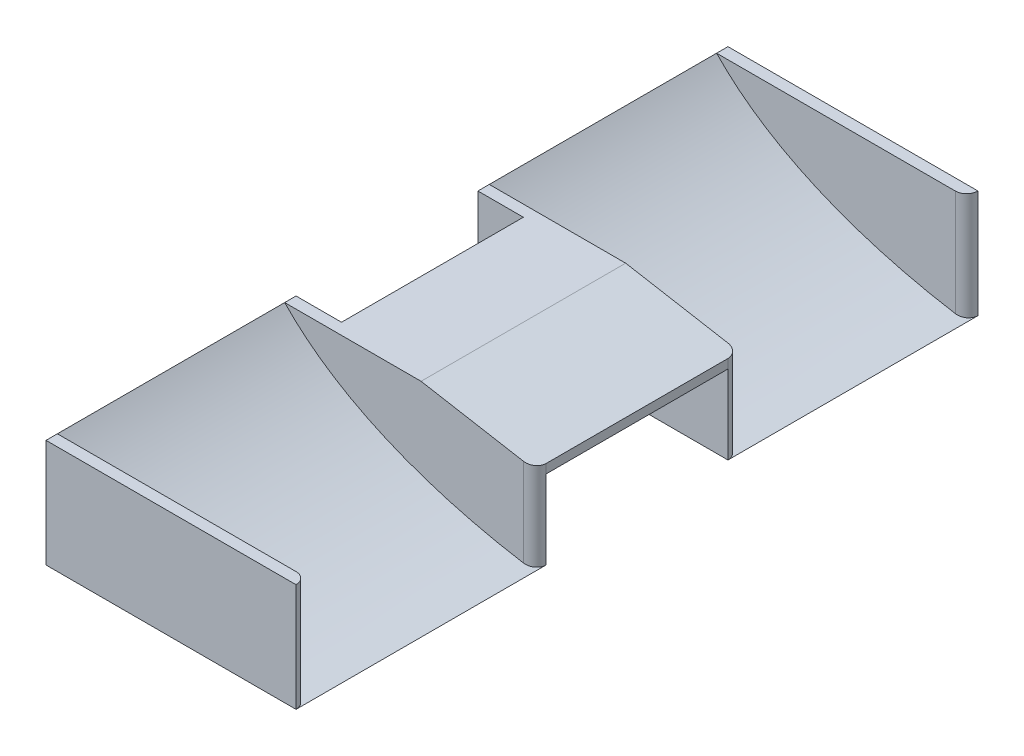
ISO-10303-21;
HEADER;
FILE_DESCRIPTION(('STEP AP214'),'2;1');
FILE_NAME('part.step','',(''),(''),'','','');
FILE_SCHEMA(('AUTOMOTIVE_DESIGN { 1 0 10303 214 1 1 1 1 }'));
ENDSEC;
DATA;
#1=APPLICATION_CONTEXT('core data for automotive mechanical design processes');
#2=APPLICATION_PROTOCOL_DEFINITION('international standard','automotive_design',2000,#1);
#3=PRODUCT_CONTEXT('',#1,'mechanical');
#4=PRODUCT('Part','Part','',(#3));
#5=PRODUCT_RELATED_PRODUCT_CATEGORY('part','',(#4));
#6=PRODUCT_DEFINITION_FORMATION('','',#4);
#7=PRODUCT_DEFINITION_CONTEXT('part definition',#1,'design');
#8=PRODUCT_DEFINITION('design','',#6,#7);
#9=PRODUCT_DEFINITION_SHAPE('','',#8);
#10=(LENGTH_UNIT() NAMED_UNIT(*) SI_UNIT(.MILLI.,.METRE.));
#11=(NAMED_UNIT(*) PLANE_ANGLE_UNIT() SI_UNIT($,.RADIAN.));
#12=(NAMED_UNIT(*) SI_UNIT($,.STERADIAN.) SOLID_ANGLE_UNIT());
#13=UNCERTAINTY_MEASURE_WITH_UNIT(LENGTH_MEASURE(1.E-05),#10,'distance_accuracy_value','');
#14=(GEOMETRIC_REPRESENTATION_CONTEXT(3) GLOBAL_UNCERTAINTY_ASSIGNED_CONTEXT((#13)) GLOBAL_UNIT_ASSIGNED_CONTEXT((#10,
#11,#12)) REPRESENTATION_CONTEXT('',''));
#15=CARTESIAN_POINT('',(0.,0.,0.));
#16=DIRECTION('',(0.,0.,1.));
#17=DIRECTION('',(1.,0.,0.));
#18=AXIS2_PLACEMENT_3D('',#15,#16,#17);
#19=CARTESIAN_POINT('',(-13.0265605576769,-8.,-9.));
#20=DIRECTION('',(0.,1.,0.));
#21=DIRECTION('',(0.,0.,1.));
#22=AXIS2_PLACEMENT_3D('',#19,#20,#21);
#23=PLANE('',#22);
#24=DIRECTION('',(0.,0.,1.));
#25=VECTOR('',#24,1.);
#26=CARTESIAN_POINT('',(8.97343944232308,-8.,-29.));
#27=LINE('',#26,#25);
#28=CARTESIAN_POINT('',(8.97343944232308,-8.,-30.));
#29=VERTEX_POINT('',#28);
#30=CARTESIAN_POINT('',(8.97343944232308,-8.,-8.));
#31=VERTEX_POINT('',#30);
#32=EDGE_CURVE('E66',#29,#31,#27,.T.);
#33=ORIENTED_EDGE('',*,*,#32,.T.);
#34=DIRECTION('',(-1.,0.,0.));
#35=VECTOR('',#34,1.);
#36=CARTESIAN_POINT('',(-13.0265605576769,-8.,-8.));
#37=LINE('',#36,#35);
#38=CARTESIAN_POINT('',(-13.0265605576769,-8.,-8.));
#39=VERTEX_POINT('',#38);
#40=EDGE_CURVE('E449',#31,#39,#37,.T.);
#41=ORIENTED_EDGE('',*,*,#40,.T.);
#42=DIRECTION('',(0.,0.,1.));
#43=VECTOR('',#42,1.);
#44=CARTESIAN_POINT('',(-13.0265605576769,-8.,-9.));
#45=LINE('',#44,#43);
#46=CARTESIAN_POINT('',(-13.0265605576769,-8.,-9.));
#47=VERTEX_POINT('',#46);
#48=EDGE_CURVE('E446',#47,#39,#45,.T.);
#49=ORIENTED_EDGE('',*,*,#48,.F.);
#50=DIRECTION('',(-1.,0.,0.));
#51=VECTOR('',#50,1.);
#52=CARTESIAN_POINT('',(-9.02656055767692,-8.,-9.));
#53=LINE('',#52,#51);
#54=CARTESIAN_POINT('',(4.10596931586014,-8.,-9.));
#55=VERTEX_POINT('',#54);
#56=EDGE_CURVE('E625',#55,#47,#53,.T.);
#57=ORIENTED_EDGE('',*,*,#56,.F.);
#58=DIRECTION('',(0.,0.,1.));
#59=VECTOR('',#58,1.);
#60=CARTESIAN_POINT('',(4.10596931586014,-8.,-29.));
#61=LINE('',#60,#59);
#62=CARTESIAN_POINT('',(4.10596931586014,-8.,-29.));
#63=VERTEX_POINT('',#62);
#64=EDGE_CURVE('E664',#63,#55,#61,.T.);
#65=ORIENTED_EDGE('',*,*,#64,.F.);
#66=DIRECTION('',(-1.,0.,0.));
#67=VECTOR('',#66,1.);
#68=CARTESIAN_POINT('',(-13.0265605576769,-8.,-29.));
#69=LINE('',#68,#67);
#70=CARTESIAN_POINT('',(-13.0265605576769,-8.,-29.));
#71=VERTEX_POINT('',#70);
#72=EDGE_CURVE('E250',#63,#71,#69,.T.);
#73=ORIENTED_EDGE('',*,*,#72,.T.);
#74=DIRECTION('',(0.,0.,1.));
#75=VECTOR('',#74,1.);
#76=CARTESIAN_POINT('',(-13.0265605576769,-8.,-30.));
#77=LINE('',#76,#75);
#78=CARTESIAN_POINT('',(-13.0265605576769,-8.,-30.));
#79=VERTEX_POINT('',#78);
#80=EDGE_CURVE('E257',#79,#71,#77,.T.);
#81=ORIENTED_EDGE('',*,*,#80,.F.);
#82=DIRECTION('',(-1.,0.,0.));
#83=VECTOR('',#82,1.);
#84=CARTESIAN_POINT('',(-13.0265605576769,-8.,-30.));
#85=LINE('',#84,#83);
#86=EDGE_CURVE('E240',#29,#79,#85,.T.);
#87=ORIENTED_EDGE('',*,*,#86,.F.);
#88=EDGE_LOOP('',(#33,#41,#49,#57,#65,#73,#81,#87));
#89=FACE_BOUND('',#88,.T.);
#90=ADVANCED_FACE('F43',(#89),#23,.F.);
#91=CARTESIAN_POINT('',(-13.0265605576769,1.5,-9.));
#92=DIRECTION('',(1.,0.,0.));
#93=DIRECTION('',(0.,0.,-1.));
#94=AXIS2_PLACEMENT_3D('',#91,#92,#93);
#95=PLANE('',#94);
#96=DIRECTION('',(0.,1.,0.));
#97=VECTOR('',#96,1.);
#98=CARTESIAN_POINT('',(-13.0265605576769,1.5,-8.));
#99=LINE('',#98,#97);
#100=CARTESIAN_POINT('',(-13.0265605576769,1.5,-8.));
#101=VERTEX_POINT('',#100);
#102=EDGE_CURVE('E438',#39,#101,#99,.T.);
#103=ORIENTED_EDGE('',*,*,#102,.T.);
#104=DIRECTION('',(0.,0.,1.));
#105=VECTOR('',#104,1.);
#106=CARTESIAN_POINT('',(-13.0265605576769,1.5,-9.));
#107=LINE('',#106,#105);
#108=CARTESIAN_POINT('',(-13.0265605576769,1.5,-9.00000000000001));
#109=VERTEX_POINT('',#108);
#110=EDGE_CURVE('E442',#109,#101,#107,.T.);
#111=ORIENTED_EDGE('',*,*,#110,.F.);
#112=DIRECTION('',(0.,0.,1.));
#113=VECTOR('',#112,1.);
#114=CARTESIAN_POINT('',(-13.0265605576769,1.5,-29.));
#115=LINE('',#114,#113);
#116=CARTESIAN_POINT('',(-13.0265605576769,1.5,-29.));
#117=VERTEX_POINT('',#116);
#118=EDGE_CURVE('E653',#117,#109,#115,.T.);
#119=ORIENTED_EDGE('',*,*,#118,.F.);
#120=DIRECTION('',(0.,0.,1.));
#121=VECTOR('',#120,1.);
#122=CARTESIAN_POINT('',(-13.0265605576769,1.5,-30.));
#123=LINE('',#122,#121);
#124=CARTESIAN_POINT('',(-13.0265605576769,1.5,-30.));
#125=VERTEX_POINT('',#124);
#126=EDGE_CURVE('E247',#125,#117,#123,.T.);
#127=ORIENTED_EDGE('',*,*,#126,.F.);
#128=DIRECTION('',(0.,1.,0.));
#129=VECTOR('',#128,1.);
#130=CARTESIAN_POINT('',(-13.0265605576769,1.5,-30.));
#131=LINE('',#130,#129);
#132=EDGE_CURVE('E231',#79,#125,#131,.T.);
#133=ORIENTED_EDGE('',*,*,#132,.F.);
#134=ORIENTED_EDGE('',*,*,#80,.T.);
#135=DIRECTION('',(0.,1.,0.));
#136=VECTOR('',#135,1.);
#137=CARTESIAN_POINT('',(-13.0265605576769,1.5,-29.));
#138=LINE('',#137,#136);
#139=CARTESIAN_POINT('',(-13.0265605576769,0.,-29.));
#140=VERTEX_POINT('',#139);
#141=EDGE_CURVE('E234',#71,#140,#138,.T.);
#142=ORIENTED_EDGE('',*,*,#141,.T.);
#143=DIRECTION('',(0.,0.,1.));
#144=VECTOR('',#143,1.);
#145=CARTESIAN_POINT('',(-13.0265605576769,0.,-29.));
#146=LINE('',#145,#144);
#147=CARTESIAN_POINT('',(-13.0265605576769,0.,-9.));
#148=VERTEX_POINT('',#147);
#149=EDGE_CURVE('E660',#140,#148,#146,.T.);
#150=ORIENTED_EDGE('',*,*,#149,.T.);
#151=DIRECTION('',(0.,1.,0.));
#152=VECTOR('',#151,1.);
#153=CARTESIAN_POINT('',(-13.0265605576769,1.5,-9.));
#154=LINE('',#153,#152);
#155=EDGE_CURVE('E469',#47,#148,#154,.T.);
#156=ORIENTED_EDGE('',*,*,#155,.F.);
#157=ORIENTED_EDGE('',*,*,#48,.T.);
#158=EDGE_LOOP('',(#103,#111,#119,#127,#133,#134,#142,#150,#156,#157));
#159=FACE_BOUND('',#158,.T.);
#160=ADVANCED_FACE('F411',(#159),#95,.F.);
#161=CARTESIAN_POINT('',(0.,0.,-9.));
#162=DIRECTION('',(0.,0.,1.));
#163=DIRECTION('',(1.,0.,0.));
#164=AXIS2_PLACEMENT_3D('',#161,#162,#163);
#165=PLANE('',#164);
#166=DIRECTION('',(-0.984807753012209,0.173648177666927,0.));
#167=VECTOR('',#166,1.);
#168=CARTESIAN_POINT('',(8.97343944232308,-0.263269807084651,-9.));
#169=LINE('',#168,#167);
#170=CARTESIAN_POINT('',(-1.02656055767713,1.5,-9.));
#171=VERTEX_POINT('',#170);
#172=CARTESIAN_POINT('',(7.97343944232308,-0.0869428263761891,-9.));
#173=VERTEX_POINT('',#172);
#174=EDGE_CURVE('E514',#171,#173,#169,.F.);
#175=ORIENTED_EDGE('',*,*,#174,.T.);
#176=DIRECTION('',(0.,-1.,0.));
#177=VECTOR('',#176,1.);
#178=CARTESIAN_POINT('',(7.97343944232308,-8.,-9.));
#179=LINE('',#178,#177);
#180=CARTESIAN_POINT('',(7.9734394421098,-7.84203256221456,-9.00000000000001));
#181=VERTEX_POINT('',#180);
#182=EDGE_CURVE('E545',#173,#181,#179,.T.);
#183=ORIENTED_EDGE('',*,*,#182,.T.);
#184=CARTESIAN_POINT('',(8.97343944232308,-8.,-9.00000000000001));
#185=CARTESIAN_POINT('',(-0.0304347585319654,-6.64818916617377,-9.00000000000001));
#186=CARTESIAN_POINT('',(-8.24117380389186,-3.530589288179,-9.00000000000001));
#187=CARTESIAN_POINT('',(-13.0265605576769,1.50000000000001,-9.00000000000001));
#188=B_SPLINE_CURVE_WITH_KNOTS('',3,(#184,#185,#186,#187),.UNSPECIFIED.,.F.,.F.,(4,4),(0.,1.),.UNSPECIFIED.);
#189=EDGE_CURVE('E581',#181,#109,#188,.T.);
#190=ORIENTED_EDGE('',*,*,#189,.T.);
#191=DIRECTION('',(1.,0.,0.));
#192=VECTOR('',#191,1.);
#193=CARTESIAN_POINT('',(-9.02656055767692,1.5,-9.));
#194=LINE('',#193,#192);
#195=EDGE_CURVE('E461',#109,#171,#194,.T.);
#196=ORIENTED_EDGE('',*,*,#195,.T.);
#197=EDGE_LOOP('',(#175,#183,#190,#196));
#198=FACE_BOUND('',#197,.T.);
#199=ADVANCED_FACE('F418',(#198),#165,.F.);
#200=CARTESIAN_POINT('',(0.,0.,9.));
#201=DIRECTION('',(0.,0.,1.));
#202=DIRECTION('',(1.,0.,0.));
#203=AXIS2_PLACEMENT_3D('',#200,#201,#202);
#204=PLANE('',#203);
#205=CARTESIAN_POINT('',(8.97343944232308,-8.,8.99999999999999));
#206=CARTESIAN_POINT('',(-0.0304347585319654,-6.64818916617377,8.99999999999999));
#207=CARTESIAN_POINT('',(-8.24117380389186,-3.530589288179,8.99999999999999));
#208=CARTESIAN_POINT('',(-13.0265605576769,1.50000000000001,8.99999999999999));
#209=B_SPLINE_CURVE_WITH_KNOTS('',3,(#205,#206,#207,#208),.UNSPECIFIED.,.F.,.F.,(4,4),(0.,1.),.UNSPECIFIED.);
#210=CARTESIAN_POINT('',(7.9734394421098,-7.84203256221456,8.99999999999999));
#211=VERTEX_POINT('',#210);
#212=CARTESIAN_POINT('',(-13.0265605576769,1.5,9.));
#213=VERTEX_POINT('',#212);
#214=EDGE_CURVE('E493',#211,#213,#209,.T.);
#215=ORIENTED_EDGE('',*,*,#214,.F.);
#216=DIRECTION('',(0.,1.,0.));
#217=VECTOR('',#216,1.);
#218=CARTESIAN_POINT('',(7.97343944232308,0.,9.));
#219=LINE('',#218,#217);
#220=CARTESIAN_POINT('',(7.97343944232308,-0.0869428263761893,9.));
#221=VERTEX_POINT('',#220);
#222=EDGE_CURVE('E357',#211,#221,#219,.T.);
#223=ORIENTED_EDGE('',*,*,#222,.T.);
#224=DIRECTION('',(0.984807753012209,-0.173648177666927,0.));
#225=VECTOR('',#224,1.);
#226=CARTESIAN_POINT('',(0.225560519075216,1.27921727105483,9.));
#227=LINE('',#226,#225);
#228=CARTESIAN_POINT('',(-1.02656055767713,1.5,9.));
#229=VERTEX_POINT('',#228);
#230=EDGE_CURVE('E508',#221,#229,#227,.F.);
#231=ORIENTED_EDGE('',*,*,#230,.T.);
#232=DIRECTION('',(-1.,0.,0.));
#233=VECTOR('',#232,1.);
#234=CARTESIAN_POINT('',(-9.02656055767692,1.5,9.));
#235=LINE('',#234,#233);
#236=EDGE_CURVE('E580',#229,#213,#235,.T.);
#237=ORIENTED_EDGE('',*,*,#236,.T.);
#238=EDGE_LOOP('',(#215,#223,#231,#237));
#239=FACE_BOUND('',#238,.T.);
#240=ADVANCED_FACE('F388',(#239),#204,.T.);
#241=CARTESIAN_POINT('',(-9.02656055767692,1.5,-8.));
#242=DIRECTION('',(0.,1.,0.));
#243=DIRECTION('',(0.,0.,1.));
#244=AXIS2_PLACEMENT_3D('',#241,#242,#243);
#245=PLANE('',#244);
#246=ORIENTED_EDGE('',*,*,#236,.F.);
#247=DIRECTION('',(0.,0.,-1.));
#248=VECTOR('',#247,1.);
#249=CARTESIAN_POINT('',(-1.02656055767713,1.5,-8.));
#250=LINE('',#249,#248);
#251=EDGE_CURVE('E511',#229,#171,#250,.T.);
#252=ORIENTED_EDGE('',*,*,#251,.T.);
#253=ORIENTED_EDGE('',*,*,#195,.F.);
#254=ORIENTED_EDGE('',*,*,#110,.T.);
#255=DIRECTION('',(1.,0.,0.));
#256=VECTOR('',#255,1.);
#257=CARTESIAN_POINT('',(8.97343944232308,1.5,-8.));
#258=LINE('',#257,#256);
#259=CARTESIAN_POINT('',(-9.02656055767692,1.5,-8.));
#260=VERTEX_POINT('',#259);
#261=EDGE_CURVE('E448',#101,#260,#258,.T.);
#262=ORIENTED_EDGE('',*,*,#261,.T.);
#263=DIRECTION('',(0.,0.,1.));
#264=VECTOR('',#263,1.);
#265=CARTESIAN_POINT('',(-9.02656055767692,1.5,-8.));
#266=LINE('',#265,#264);
#267=CARTESIAN_POINT('',(-9.02656055767692,1.5,8.));
#268=VERTEX_POINT('',#267);
#269=EDGE_CURVE('E482',#260,#268,#266,.T.);
#270=ORIENTED_EDGE('',*,*,#269,.T.);
#271=DIRECTION('',(-1.,0.,0.));
#272=VECTOR('',#271,1.);
#273=CARTESIAN_POINT('',(-9.02656055767692,1.5,8.));
#274=LINE('',#273,#272);
#275=CARTESIAN_POINT('',(-13.0265605576769,1.5,7.99999999999998));
#276=VERTEX_POINT('',#275);
#277=EDGE_CURVE('E604',#268,#276,#274,.T.);
#278=ORIENTED_EDGE('',*,*,#277,.T.);
#279=DIRECTION('',(0.,0.,-1.));
#280=VECTOR('',#279,1.);
#281=CARTESIAN_POINT('',(-13.0265605576769,1.5,9.));
#282=LINE('',#281,#280);
#283=EDGE_CURVE('E621',#213,#276,#282,.T.);
#284=ORIENTED_EDGE('',*,*,#283,.F.);
#285=EDGE_LOOP('',(#246,#252,#253,#254,#262,#270,#278,#284));
#286=FACE_BOUND('',#285,.T.);
#287=ADVANCED_FACE('F384',(#286),#245,.T.);
#288=CARTESIAN_POINT('',(8.97343944232308,1.5,-8.));
#289=DIRECTION('',(1.,0.,0.));
#290=DIRECTION('',(0.,0.,-1.));
#291=AXIS2_PLACEMENT_3D('',#288,#289,#290);
#292=PLANE('',#291);
#293=DIRECTION('',(0.,0.,-1.));
#294=VECTOR('',#293,1.);
#295=CARTESIAN_POINT('',(8.97343944232308,-1.06255668237038,-8.));
#296=LINE('',#295,#294);
#297=CARTESIAN_POINT('',(8.97343944232308,-1.06255668237038,8.));
#298=VERTEX_POINT('',#297);
#299=CARTESIAN_POINT('',(8.97343944232308,-1.06255668237038,-8.));
#300=VERTEX_POINT('',#299);
#301=EDGE_CURVE('E521',#298,#300,#296,.T.);
#302=ORIENTED_EDGE('',*,*,#301,.T.);
#303=DIRECTION('',(0.,-1.,0.));
#304=VECTOR('',#303,1.);
#305=CARTESIAN_POINT('',(8.97343944232308,-0.263269807084651,-8.));
#306=LINE('',#305,#304);
#307=CARTESIAN_POINT('',(8.97343944232308,-0.263269807084651,-8.));
#308=VERTEX_POINT('',#307);
#309=EDGE_CURVE('E555',#300,#308,#306,.F.);
#310=ORIENTED_EDGE('',*,*,#309,.T.);
#311=DIRECTION('',(0.,0.,1.));
#312=VECTOR('',#311,1.);
#313=CARTESIAN_POINT('',(8.97343944232308,-0.263269807084651,-8.));
#314=LINE('',#313,#312);
#315=CARTESIAN_POINT('',(8.97343944232308,-0.263269807084651,8.));
#316=VERTEX_POINT('',#315);
#317=EDGE_CURVE('E501',#308,#316,#314,.T.);
#318=ORIENTED_EDGE('',*,*,#317,.T.);
#319=DIRECTION('',(0.,1.,0.));
#320=VECTOR('',#319,1.);
#321=CARTESIAN_POINT('',(8.97343944232308,1.5,8.));
#322=LINE('',#321,#320);
#323=EDGE_CURVE('E552',#316,#298,#322,.F.);
#324=ORIENTED_EDGE('',*,*,#323,.T.);
#325=EDGE_LOOP('',(#302,#310,#318,#324));
#326=FACE_BOUND('',#325,.T.);
#327=ADVANCED_FACE('F387',(#326),#292,.T.);
#328=CARTESIAN_POINT('',(-9.02656055767692,-1.5,-8.));
#329=DIRECTION('',(0.,-1.,0.));
#330=DIRECTION('',(0.,0.,-1.));
#331=AXIS2_PLACEMENT_3D('',#328,#329,#330);
#332=PLANE('',#331);
#333=DIRECTION('',(1.,0.,0.));
#334=VECTOR('',#333,1.);
#335=CARTESIAN_POINT('',(-9.02656055767692,-1.5,-8.));
#336=LINE('',#335,#334);
#337=CARTESIAN_POINT('',(-9.02656055767692,-1.5,-8.));
#338=VERTEX_POINT('',#337);
#339=CARTESIAN_POINT('',(3.97343944232286,-1.5,-8.));
#340=VERTEX_POINT('',#339);
#341=EDGE_CURVE('E478',#338,#340,#336,.T.);
#342=ORIENTED_EDGE('',*,*,#341,.T.);
#343=DIRECTION('',(0.,0.,1.));
#344=VECTOR('',#343,1.);
#345=CARTESIAN_POINT('',(3.97343944232286,-1.5,-8.));
#346=LINE('',#345,#344);
#347=CARTESIAN_POINT('',(3.97343944232286,-1.5,8.));
#348=VERTEX_POINT('',#347);
#349=EDGE_CURVE('E518',#340,#348,#346,.T.);
#350=ORIENTED_EDGE('',*,*,#349,.T.);
#351=DIRECTION('',(1.,0.,0.));
#352=VECTOR('',#351,1.);
#353=CARTESIAN_POINT('',(-9.02656055767692,-1.5,8.));
#354=LINE('',#353,#352);
#355=CARTESIAN_POINT('',(-9.02656055767692,-1.5,8.));
#356=VERTEX_POINT('',#355);
#357=EDGE_CURVE('E474',#356,#348,#354,.T.);
#358=ORIENTED_EDGE('',*,*,#357,.F.);
#359=DIRECTION('',(0.,0.,1.));
#360=VECTOR('',#359,1.);
#361=CARTESIAN_POINT('',(-9.02656055767692,-1.5,-8.));
#362=LINE('',#361,#360);
#363=EDGE_CURVE('E483',#338,#356,#362,.T.);
#364=ORIENTED_EDGE('',*,*,#363,.F.);
#365=EDGE_LOOP('',(#342,#350,#358,#364));
#366=FACE_BOUND('',#365,.T.);
#367=ADVANCED_FACE('F394',(#366),#332,.T.);
#368=CARTESIAN_POINT('',(-9.02656055767692,1.5,-8.));
#369=DIRECTION('',(-1.,0.,0.));
#370=DIRECTION('',(0.,0.,1.));
#371=AXIS2_PLACEMENT_3D('',#368,#369,#370);
#372=PLANE('',#371);
#373=ORIENTED_EDGE('',*,*,#363,.T.);
#374=DIRECTION('',(0.,-1.,0.));
#375=VECTOR('',#374,1.);
#376=CARTESIAN_POINT('',(-9.02656055767692,1.5,8.));
#377=LINE('',#376,#375);
#378=EDGE_CURVE('E467',#268,#356,#377,.T.);
#379=ORIENTED_EDGE('',*,*,#378,.F.);
#380=ORIENTED_EDGE('',*,*,#269,.F.);
#381=DIRECTION('',(0.,-1.,0.));
#382=VECTOR('',#381,1.);
#383=CARTESIAN_POINT('',(-9.02656055767692,1.5,-8.));
#384=LINE('',#383,#382);
#385=EDGE_CURVE('E453',#260,#338,#384,.T.);
#386=ORIENTED_EDGE('',*,*,#385,.T.);
#387=EDGE_LOOP('',(#373,#379,#380,#386));
#388=FACE_BOUND('',#387,.T.);
#389=ADVANCED_FACE('F390',(#388),#372,.T.);
#390=CARTESIAN_POINT('',(0.,0.,-8.));
#391=DIRECTION('',(0.,0.,1.));
#392=DIRECTION('',(1.,0.,0.));
#393=AXIS2_PLACEMENT_3D('',#390,#391,#392);
#394=PLANE('',#393);
#395=ORIENTED_EDGE('',*,*,#261,.F.);
#396=ORIENTED_EDGE('',*,*,#102,.F.);
#397=ORIENTED_EDGE('',*,*,#40,.F.);
#398=DIRECTION('',(0.,-1.,0.));
#399=VECTOR('',#398,1.);
#400=CARTESIAN_POINT('',(8.97343944232308,-8.,-8.));
#401=LINE('',#400,#399);
#402=EDGE_CURVE('E456',#300,#31,#401,.T.);
#403=ORIENTED_EDGE('',*,*,#402,.F.);
#404=DIRECTION('',(0.996194698091746,0.0871557427476548,0.));
#405=VECTOR('',#404,1.);
#406=CARTESIAN_POINT('',(3.97343944232286,-1.5,-8.));
#407=LINE('',#406,#405);
#408=EDGE_CURVE('E528',#300,#340,#407,.F.);
#409=ORIENTED_EDGE('',*,*,#408,.T.);
#410=ORIENTED_EDGE('',*,*,#341,.F.);
#411=ORIENTED_EDGE('',*,*,#385,.F.);
#412=EDGE_LOOP('',(#395,#396,#397,#403,#409,#410,#411));
#413=FACE_BOUND('',#412,.T.);
#414=ADVANCED_FACE('F393',(#413),#394,.T.);
#415=DIRECTION('',(1.,0.,0.));
#416=VECTOR('',#415,1.);
#417=CARTESIAN_POINT('',(-9.02656055767692,-8.,8.));
#418=LINE('',#417,#416);
#419=CARTESIAN_POINT('',(-13.0265605576769,-8.,8.));
#420=VERTEX_POINT('',#419);
#421=CARTESIAN_POINT('',(8.97343944232308,-8.,7.99999999999998));
#422=VERTEX_POINT('',#421);
#423=EDGE_CURVE('E589',#420,#422,#418,.T.);
#424=ORIENTED_EDGE('',*,*,#423,.T.);
#425=CARTESIAN_POINT('',(8.97343944232308,-8.,30.));
#426=VERTEX_POINT('',#425);
#427=EDGE_CURVE('E666',#422,#426,#27,.T.);
#428=ORIENTED_EDGE('',*,*,#427,.T.);
#429=DIRECTION('',(1.,0.,0.));
#430=VECTOR('',#429,1.);
#431=CARTESIAN_POINT('',(-13.0265605576769,-8.,30.));
#432=LINE('',#431,#430);
#433=CARTESIAN_POINT('',(-13.0265605576769,-8.,30.));
#434=VERTEX_POINT('',#433);
#435=EDGE_CURVE('E269',#434,#426,#432,.T.);
#436=ORIENTED_EDGE('',*,*,#435,.F.);
#437=DIRECTION('',(0.,0.,-1.));
#438=VECTOR('',#437,1.);
#439=CARTESIAN_POINT('',(-13.0265605576769,-8.,30.));
#440=LINE('',#439,#438);
#441=CARTESIAN_POINT('',(-13.0265605576769,-8.,29.));
#442=VERTEX_POINT('',#441);
#443=EDGE_CURVE('E277',#434,#442,#440,.T.);
#444=ORIENTED_EDGE('',*,*,#443,.T.);
#445=DIRECTION('',(1.,0.,0.));
#446=VECTOR('',#445,1.);
#447=CARTESIAN_POINT('',(-13.0265605576769,-8.,29.));
#448=LINE('',#447,#446);
#449=CARTESIAN_POINT('',(4.10596931586014,-8.,29.));
#450=VERTEX_POINT('',#449);
#451=EDGE_CURVE('E266',#442,#450,#448,.T.);
#452=ORIENTED_EDGE('',*,*,#451,.T.);
#453=CARTESIAN_POINT('',(4.10596931586014,-8.,9.));
#454=VERTEX_POINT('',#453);
#455=EDGE_CURVE('E663',#454,#450,#61,.T.);
#456=ORIENTED_EDGE('',*,*,#455,.F.);
#457=DIRECTION('',(1.,0.,0.));
#458=VECTOR('',#457,1.);
#459=CARTESIAN_POINT('',(-13.0265605576769,-8.,9.));
#460=LINE('',#459,#458);
#461=CARTESIAN_POINT('',(-13.0265605576769,-8.,9.));
#462=VERTEX_POINT('',#461);
#463=EDGE_CURVE('E607',#462,#454,#460,.T.);
#464=ORIENTED_EDGE('',*,*,#463,.F.);
#465=DIRECTION('',(0.,0.,-1.));
#466=VECTOR('',#465,1.);
#467=CARTESIAN_POINT('',(-13.0265605576769,-8.,9.));
#468=LINE('',#467,#466);
#469=EDGE_CURVE('E609',#462,#420,#468,.T.);
#470=ORIENTED_EDGE('',*,*,#469,.T.);
#471=EDGE_LOOP('',(#424,#428,#436,#444,#452,#456,#464,#470));
#472=FACE_BOUND('',#471,.T.);
#473=ADVANCED_FACE('F402',(#472),#23,.F.);
#474=ORIENTED_EDGE('',*,*,#283,.T.);
#475=DIRECTION('',(0.,-1.,0.));
#476=VECTOR('',#475,1.);
#477=CARTESIAN_POINT('',(-13.0265605576769,1.5,8.));
#478=LINE('',#477,#476);
#479=EDGE_CURVE('E583',#276,#420,#478,.T.);
#480=ORIENTED_EDGE('',*,*,#479,.T.);
#481=ORIENTED_EDGE('',*,*,#469,.F.);
#482=DIRECTION('',(0.,-1.,0.));
#483=VECTOR('',#482,1.);
#484=CARTESIAN_POINT('',(-13.0265605576769,1.5,9.));
#485=LINE('',#484,#483);
#486=CARTESIAN_POINT('',(-13.0265605576769,0.,8.99999999999999));
#487=VERTEX_POINT('',#486);
#488=EDGE_CURVE('E603',#487,#462,#485,.T.);
#489=ORIENTED_EDGE('',*,*,#488,.F.);
#490=CARTESIAN_POINT('',(-13.0265605576769,0.,29.));
#491=VERTEX_POINT('',#490);
#492=EDGE_CURVE('E657',#487,#491,#146,.T.);
#493=ORIENTED_EDGE('',*,*,#492,.T.);
#494=DIRECTION('',(0.,-1.,0.));
#495=VECTOR('',#494,1.);
#496=CARTESIAN_POINT('',(-13.0265605576769,1.5,29.));
#497=LINE('',#496,#495);
#498=EDGE_CURVE('E281',#491,#442,#497,.T.);
#499=ORIENTED_EDGE('',*,*,#498,.T.);
#500=ORIENTED_EDGE('',*,*,#443,.F.);
#501=DIRECTION('',(0.,-1.,0.));
#502=VECTOR('',#501,1.);
#503=CARTESIAN_POINT('',(-13.0265605576769,1.5,30.));
#504=LINE('',#503,#502);
#505=CARTESIAN_POINT('',(-13.0265605576769,1.5,30.));
#506=VERTEX_POINT('',#505);
#507=EDGE_CURVE('E265',#506,#434,#504,.T.);
#508=ORIENTED_EDGE('',*,*,#507,.F.);
#509=DIRECTION('',(0.,0.,-1.));
#510=VECTOR('',#509,1.);
#511=CARTESIAN_POINT('',(-13.0265605576769,1.5,30.));
#512=LINE('',#511,#510);
#513=CARTESIAN_POINT('',(-13.0265605576769,1.5,29.));
#514=VERTEX_POINT('',#513);
#515=EDGE_CURVE('E287',#506,#514,#512,.T.);
#516=ORIENTED_EDGE('',*,*,#515,.T.);
#517=EDGE_CURVE('E650',#213,#514,#115,.T.);
#518=ORIENTED_EDGE('',*,*,#517,.F.);
#519=EDGE_LOOP('',(#474,#480,#481,#489,#493,#499,#500,#508,#516,#518));
#520=FACE_BOUND('',#519,.T.);
#521=ADVANCED_FACE('F405',(#520),#95,.F.);
#522=ORIENTED_EDGE('',*,*,#155,.T.);
#523=CARTESIAN_POINT('',(-13.0265605576769,0.,-9.00000000000001));
#524=CARTESIAN_POINT('',(-5.6316636817653,-6.68042013227032,-9.00000000000001));
#525=CARTESIAN_POINT('',(4.10596931586014,-8.,-9.00000000000001));
#526=B_SPLINE_CURVE_WITH_KNOTS('',2,(#523,#524,#525),.UNSPECIFIED.,.F.,.F.,(3,3),(0.,1.),.UNSPECIFIED.);
#527=EDGE_CURVE('E584',#148,#55,#526,.T.);
#528=ORIENTED_EDGE('',*,*,#527,.T.);
#529=ORIENTED_EDGE('',*,*,#56,.T.);
#530=EDGE_LOOP('',(#522,#528,#529));
#531=FACE_BOUND('',#530,.T.);
#532=ADVANCED_FACE('F409',(#531),#165,.F.);
#533=CARTESIAN_POINT('',(0.,0.,8.));
#534=DIRECTION('',(0.,0.,1.));
#535=DIRECTION('',(1.,0.,0.));
#536=AXIS2_PLACEMENT_3D('',#533,#534,#535);
#537=PLANE('',#536);
#538=ORIENTED_EDGE('',*,*,#378,.T.);
#539=ORIENTED_EDGE('',*,*,#357,.T.);
#540=DIRECTION('',(-0.996194698091746,-0.0871557427476548,0.));
#541=VECTOR('',#540,1.);
#542=CARTESIAN_POINT('',(0.160418869949592,-1.83359607387378,8.));
#543=LINE('',#542,#541);
#544=EDGE_CURVE('E525',#348,#298,#543,.F.);
#545=ORIENTED_EDGE('',*,*,#544,.T.);
#546=DIRECTION('',(0.,1.,0.));
#547=VECTOR('',#546,1.);
#548=CARTESIAN_POINT('',(8.97343944232308,1.5,8.));
#549=LINE('',#548,#547);
#550=EDGE_CURVE('E613',#422,#298,#549,.T.);
#551=ORIENTED_EDGE('',*,*,#550,.F.);
#552=ORIENTED_EDGE('',*,*,#423,.F.);
#553=ORIENTED_EDGE('',*,*,#479,.F.);
#554=ORIENTED_EDGE('',*,*,#277,.F.);
#555=EDGE_LOOP('',(#538,#539,#545,#551,#552,#553,#554));
#556=FACE_BOUND('',#555,.T.);
#557=ADVANCED_FACE('F416',(#556),#537,.F.);
#558=CARTESIAN_POINT('',(-13.0265605576769,0.,8.99999999999999));
#559=CARTESIAN_POINT('',(-5.6316636817653,-6.68042013227032,8.99999999999999));
#560=CARTESIAN_POINT('',(4.10596931586014,-8.,8.99999999999999));
#561=B_SPLINE_CURVE_WITH_KNOTS('',2,(#558,#559,#560),.UNSPECIFIED.,.F.,.F.,(3,3),(0.,1.),.UNSPECIFIED.);
#562=EDGE_CURVE('E485',#487,#454,#561,.T.);
#563=ORIENTED_EDGE('',*,*,#562,.F.);
#564=ORIENTED_EDGE('',*,*,#488,.T.);
#565=ORIENTED_EDGE('',*,*,#463,.T.);
#566=EDGE_LOOP('',(#563,#564,#565));
#567=FACE_BOUND('',#566,.T.);
#568=ADVANCED_FACE('F330',(#567),#204,.T.);
#569=CARTESIAN_POINT('',(-13.0265605576769,0.,-29.));
#570=CARTESIAN_POINT('',(-5.6316636817653,-6.68042013227032,-29.));
#571=CARTESIAN_POINT('',(4.10596931586014,-8.,-29.));
#572=B_SPLINE_CURVE_WITH_KNOTS('',2,(#569,#570,#571),.UNSPECIFIED.,.F.,.F.,(3,3),(0.,1.),.UNSPECIFIED.);
#573=DIRECTION('',(0.,0.,1.));
#574=VECTOR('',#573,1.);
#575=SURFACE_OF_LINEAR_EXTRUSION('',#572,#574);
#576=ORIENTED_EDGE('',*,*,#492,.F.);
#577=ORIENTED_EDGE('',*,*,#562,.T.);
#578=ORIENTED_EDGE('',*,*,#455,.T.);
#579=CARTESIAN_POINT('',(-13.0265605576769,0.,29.));
#580=CARTESIAN_POINT('',(-5.6316636817653,-6.68042013227032,29.));
#581=CARTESIAN_POINT('',(4.10596931586014,-8.,29.));
#582=B_SPLINE_CURVE_WITH_KNOTS('',2,(#579,#580,#581),.UNSPECIFIED.,.F.,.F.,(3,3),(0.,1.),.UNSPECIFIED.);
#583=EDGE_CURVE('E296',#491,#450,#582,.T.);
#584=ORIENTED_EDGE('',*,*,#583,.F.);
#585=EDGE_LOOP('',(#576,#577,#578,#584));
#586=FACE_BOUND('',#585,.T.);
#587=ADVANCED_FACE('F327',(#586),#575,.T.);
#588=CARTESIAN_POINT('',(8.97343944232308,-8.,-29.));
#589=CARTESIAN_POINT('',(-0.0304347585319654,-6.64818916617377,-29.));
#590=CARTESIAN_POINT('',(-8.24117380389186,-3.530589288179,-29.));
#591=CARTESIAN_POINT('',(-13.0265605576769,1.50000000000001,-29.));
#592=B_SPLINE_CURVE_WITH_KNOTS('',3,(#588,#589,#590,#591),.UNSPECIFIED.,.F.,.F.,(4,4),(0.,1.),.UNSPECIFIED.);
#593=DIRECTION('',(0.,0.,1.));
#594=VECTOR('',#593,1.);
#595=SURFACE_OF_LINEAR_EXTRUSION('',#592,#594);
#596=ORIENTED_EDGE('',*,*,#427,.F.);
#597=CARTESIAN_POINT('',(8.97343944232308,-8.,7.99999999999999));
#598=CARTESIAN_POINT('',(8.9734394066341,-7.99999989144172,8.02790144058581));
#599=CARTESIAN_POINT('',(8.97227095366752,-7.99982457822493,8.05578943188641));
#600=CARTESIAN_POINT('',(8.96761059908037,-7.99912467659939,8.11136428431285));
#601=CARTESIAN_POINT('',(8.96411885300271,-7.99860011157282,8.13905115877788));
#602=CARTESIAN_POINT('',(8.95019655547529,-7.99650691673296,8.22144764477495));
#603=CARTESIAN_POINT('',(8.93631882387218,-7.99441877540103,8.2756027686183));
#604=CARTESIAN_POINT('',(8.89978176448272,-7.98890177077607,8.38078229995006));
#605=CARTESIAN_POINT('',(8.87711908474783,-7.98547239572297,8.43180550381788));
#606=CARTESIAN_POINT('',(8.82368829483207,-7.977348344156,8.52930574631431));
#607=CARTESIAN_POINT('',(8.79292095431061,-7.97265378778915,8.57578321605429));
#608=CARTESIAN_POINT('',(8.72403469081616,-7.96208121666909,8.66311107069498));
#609=CARTESIAN_POINT('',(8.68588253240135,-7.95619784618109,8.70393452826106));
#610=CARTESIAN_POINT('',(8.60339638842759,-7.94339104027714,8.77861804830526));
#611=CARTESIAN_POINT('',(8.55906191721378,-7.93646752314861,8.81247756320949));
#612=CARTESIAN_POINT('',(8.48867312314061,-7.92539298479418,8.85751102298008));
#613=CARTESIAN_POINT('',(8.46440531781442,-7.92156157203195,8.8716296674879));
#614=CARTESIAN_POINT('',(8.41481996386365,-7.9137033267037,8.8977572873855));
#615=CARTESIAN_POINT('',(8.38950337957029,-7.90967667310144,8.90976814986094));
#616=CARTESIAN_POINT('',(8.31220618317068,-7.89733394877574,8.94252919878217));
#617=CARTESIAN_POINT('',(8.25883918118237,-7.8887489988958,8.96003268934162));
#618=CARTESIAN_POINT('',(8.16659637026708,-7.8737873753367,8.98194226539419));
#619=CARTESIAN_POINT('',(8.12823547425235,-7.86753080516298,8.98871074497053));
#620=CARTESIAN_POINT('',(8.05106787342711,-7.85487352698097,8.99773806399755));
#621=CARTESIAN_POINT('',(8.01226189483263,-7.84847304087628,9.00000342125892));
#622=CARTESIAN_POINT('',(7.97343944211441,-7.84203256221532,8.99999999999998));
#623=B_SPLINE_CURVE_WITH_KNOTS('',3,(#597,#598,#599,#600,#601,#602,#603,#604,#605,#606,#607,
#608,#609,#610,#611,#612,#613,#614,#615,#616,#617,#618,#619,#620,#621,#622),.UNSPECIFIED.,.F.,
.F.,(4,2,2,2,2,2,2,2,2,2,2,2,4),(0.,0.0836526384536281,0.167299676983135,0.3342690115025,
0.501302116960028,0.668319365827675,0.836106529176327,1.0039068805676,1.08882895743149,
1.17367461177862,1.34322782122924,1.46134782709189,1.57929674143257),.UNSPECIFIED.);
#624=EDGE_CURVE('E11',#422,#211,#623,.T.);
#625=ORIENTED_EDGE('',*,*,#624,.T.);
#626=ORIENTED_EDGE('',*,*,#214,.T.);
#627=ORIENTED_EDGE('',*,*,#517,.T.);
#628=CARTESIAN_POINT('',(8.97343944232308,-8.,29.));
#629=CARTESIAN_POINT('',(-0.0304347585319654,-6.64818916617377,29.));
#630=CARTESIAN_POINT('',(-8.24117380389186,-3.530589288179,29.));
#631=CARTESIAN_POINT('',(-13.0265605576769,1.50000000000001,29.));
#632=B_SPLINE_CURVE_WITH_KNOTS('',3,(#628,#629,#630,#631),.UNSPECIFIED.,.F.,.F.,(4,4),(0.,1.),.UNSPECIFIED.);
#633=CARTESIAN_POINT('',(7.9734394421098,-7.84203256221456,29.));
#634=VERTEX_POINT('',#633);
#635=EDGE_CURVE('E291',#634,#514,#632,.T.);
#636=ORIENTED_EDGE('',*,*,#635,.F.);
#637=CARTESIAN_POINT('',(7.97343944232308,-7.84203256092884,29.));
#638=CARTESIAN_POINT('',(8.03016997583015,-7.85144600404237,28.9999597394985));
#639=CARTESIAN_POINT('',(8.08689434495612,-7.86077549547889,29.0048264411131));
#640=CARTESIAN_POINT('',(8.19875249478948,-7.87902689024578,29.0240732855129));
#641=CARTESIAN_POINT('',(8.25388683270848,-7.88794893701695,29.0384500522463));
#642=CARTESIAN_POINT('',(8.36106464925056,-7.90515847665624,29.0764295251471));
#643=CARTESIAN_POINT('',(8.41310605420221,-7.91344554485316,29.1000383423641));
#644=CARTESIAN_POINT('',(8.48759752209311,-7.92522380457073,29.1418307433686));
#645=CARTESIAN_POINT('',(8.51183401327045,-7.92904133975707,29.1568256374246));
#646=CARTESIAN_POINT('',(8.55898913341343,-7.93644337152212,29.1888620291423));
#647=CARTESIAN_POINT('',(8.5819064185925,-7.94002763094738,29.2059055609039));
#648=CARTESIAN_POINT('',(8.64803744972589,-7.95033703612205,29.2596470213031));
#649=CARTESIAN_POINT('',(8.68904812096388,-7.95668470063941,29.2991907747679));
#650=CARTESIAN_POINT('',(8.76382660400349,-7.96819918005409,29.3847634323089));
#651=CARTESIAN_POINT('',(8.79759527680505,-7.97336613533052,29.4307915643792));
#652=CARTESIAN_POINT('',(8.84186856161504,-7.98011372715295,29.5033860785117));
#653=CARTESIAN_POINT('',(8.85550885717307,-7.98218762973641,29.5280402976541));
#654=CARTESIAN_POINT('',(8.88066092851462,-7.98600500144506,29.5784060828163));
#655=CARTESIAN_POINT('',(8.89217456691508,-7.98774875975847,29.6041166992353));
#656=CARTESIAN_POINT('',(8.92339101500357,-7.99246989840067,29.6825868949606));
#657=CARTESIAN_POINT('',(8.93980536107242,-7.99494261135952,29.7367439179469));
#658=CARTESIAN_POINT('',(8.95882042520316,-7.99780389338,29.8260667348577));
#659=CARTESIAN_POINT('',(8.96429916957646,-7.99862723647424,29.860644017013));
#660=CARTESIAN_POINT('',(8.97160680030155,-7.99972486143962,29.9301401653722));
#661=CARTESIAN_POINT('',(8.97344095152305,-7.99999993532575,29.9650584655136));
#662=CARTESIAN_POINT('',(8.97343944232308,-8.,30.));
#663=B_SPLINE_CURVE_WITH_KNOTS('',3,(#637,#638,#639,#640,#641,#642,#643,#644,#645,#646,#647,
#648,#649,#650,#651,#652,#653,#654,#655,#656,#657,#658,#659,#660,#661,#662),.UNSPECIFIED.,.F.,
.F.,(4,2,2,2,2,2,2,2,2,2,2,2,4),(0.,0.172278532059769,0.344495938423672,0.516827535617109,
0.603001844044746,0.689262433230939,0.860351225728607,1.03141966621919,1.11608574555376,
1.20067731541598,1.36965481244987,1.47453611738525,1.57926580347608),.UNSPECIFIED.);
#664=EDGE_CURVE('E343',#634,#426,#663,.T.);
#665=ORIENTED_EDGE('',*,*,#664,.T.);
#666=EDGE_LOOP('',(#596,#625,#626,#627,#636,#665));
#667=FACE_BOUND('',#666,.T.);
#668=ADVANCED_FACE('F321',(#667),#595,.T.);
#669=ORIENTED_EDGE('',*,*,#189,.F.);
#670=CARTESIAN_POINT('',(7.97343944232308,-7.84203256092884,-9.));
#671=CARTESIAN_POINT('',(8.03016997583014,-7.85144600404237,-9.00004026050154));
#672=CARTESIAN_POINT('',(8.08689434495611,-7.86077549547889,-8.99517355888694));
#673=CARTESIAN_POINT('',(8.19875249478948,-7.87902689024578,-8.97592671448708));
#674=CARTESIAN_POINT('',(8.25388683270847,-7.88794893701694,-8.9615499477537));
#675=CARTESIAN_POINT('',(8.36106464925055,-7.90515847665624,-8.92357047485296));
#676=CARTESIAN_POINT('',(8.4131060542022,-7.91344554485316,-8.89996165763589));
#677=CARTESIAN_POINT('',(8.4875975220931,-7.92522380457073,-8.85816925663141));
#678=CARTESIAN_POINT('',(8.51183401327044,-7.92904133975707,-8.84317436257545));
#679=CARTESIAN_POINT('',(8.55898913341342,-7.93644337152212,-8.81113797085768));
#680=CARTESIAN_POINT('',(8.5819064185925,-7.94002763094739,-8.79409443909608));
#681=CARTESIAN_POINT('',(8.64803744972589,-7.95033703612206,-8.74035297869688));
#682=CARTESIAN_POINT('',(8.68904812096388,-7.95668470063942,-8.70080922523216));
#683=CARTESIAN_POINT('',(8.76382660400348,-7.96819918005409,-8.61523656769114));
#684=CARTESIAN_POINT('',(8.79759527680504,-7.97336613533051,-8.5692084356208));
#685=CARTESIAN_POINT('',(8.84186856161504,-7.98011372715294,-8.49661392148827));
#686=CARTESIAN_POINT('',(8.85550885717306,-7.98218762973641,-8.47195970234588));
#687=CARTESIAN_POINT('',(8.88066092851461,-7.98600500144505,-8.42159391718374));
#688=CARTESIAN_POINT('',(8.89217456691508,-7.98774875975847,-8.39588330076467));
#689=CARTESIAN_POINT('',(8.92339101500357,-7.99246989840066,-8.31741310503942));
#690=CARTESIAN_POINT('',(8.9398053610724,-7.99494261135952,-8.2632560820531));
#691=CARTESIAN_POINT('',(8.95882042520315,-7.99780389338,-8.17393326514234));
#692=CARTESIAN_POINT('',(8.96429916957645,-7.99862723647424,-8.139355982987));
#693=CARTESIAN_POINT('',(8.97160680030155,-7.99972486143962,-8.06985983462784));
#694=CARTESIAN_POINT('',(8.97344095152305,-7.99999993532575,-8.03494153448635));
#695=CARTESIAN_POINT('',(8.97343944232308,-8.,-8.00000000000001));
#696=B_SPLINE_CURVE_WITH_KNOTS('',3,(#670,#671,#672,#673,#674,#675,#676,#677,#678,#679,#680,
#681,#682,#683,#684,#685,#686,#687,#688,#689,#690,#691,#692,#693,#694,#695),.UNSPECIFIED.,.F.,
.F.,(4,2,2,2,2,2,2,2,2,2,2,2,4),(0.,0.172278532059765,0.344495938423665,0.516827535617101,
0.603001844044738,0.689262433230932,0.860351225728599,1.03141966621918,1.11608574555376,
1.20067731541598,1.36965481244986,1.47453611738525,1.5792658034761),.UNSPECIFIED.);
#697=EDGE_CURVE('E59',#181,#31,#696,.T.);
#698=ORIENTED_EDGE('',*,*,#697,.T.);
#699=ORIENTED_EDGE('',*,*,#32,.F.);
#700=CARTESIAN_POINT('',(8.97343944232308,-8.,-30.));
#701=CARTESIAN_POINT('',(8.9734394066341,-7.99999989144172,-29.9720985594142));
#702=CARTESIAN_POINT('',(8.97227095366752,-7.99982457822493,-29.9442105681136));
#703=CARTESIAN_POINT('',(8.96761059908037,-7.99912467659939,-29.8886357156871));
#704=CARTESIAN_POINT('',(8.96411885300271,-7.99860011157281,-29.8609488412221));
#705=CARTESIAN_POINT('',(8.95019655547529,-7.99650691673295,-29.778552355225));
#706=CARTESIAN_POINT('',(8.93631882387218,-7.99441877540103,-29.7243972313817));
#707=CARTESIAN_POINT('',(8.89978176448272,-7.98890177077607,-29.6192177000499));
#708=CARTESIAN_POINT('',(8.87711908474783,-7.98547239572297,-29.5681944961821));
#709=CARTESIAN_POINT('',(8.82368829483207,-7.977348344156,-29.4706942536857));
#710=CARTESIAN_POINT('',(8.79292095431061,-7.97265378778915,-29.4242167839457));
#711=CARTESIAN_POINT('',(8.72403469081616,-7.96208121666909,-29.336888929305));
#712=CARTESIAN_POINT('',(8.68588253240134,-7.95619784618109,-29.2960654717389));
#713=CARTESIAN_POINT('',(8.60339638842759,-7.94339104027714,-29.2213819516947));
#714=CARTESIAN_POINT('',(8.55906191721379,-7.93646752314861,-29.1875224367905));
#715=CARTESIAN_POINT('',(8.48867312314061,-7.92539298479418,-29.1424889770199));
#716=CARTESIAN_POINT('',(8.46440531781441,-7.92156157203195,-29.1283703325121));
#717=CARTESIAN_POINT('',(8.41481996386364,-7.9137033267037,-29.1022427126145));
#718=CARTESIAN_POINT('',(8.38950337957029,-7.90967667310144,-29.0902318501391));
#719=CARTESIAN_POINT('',(8.31220618317068,-7.89733394877573,-29.0574708012178));
#720=CARTESIAN_POINT('',(8.25883918118237,-7.8887489988958,-29.0399673106584));
#721=CARTESIAN_POINT('',(8.16659637026707,-7.8737873753367,-29.0180577346058));
#722=CARTESIAN_POINT('',(8.12823547425234,-7.86753080516298,-29.0112892550295));
#723=CARTESIAN_POINT('',(8.05106787342711,-7.85487352698097,-29.0022619360024));
#724=CARTESIAN_POINT('',(8.01226189483263,-7.84847304087628,-28.9999965787411));
#725=CARTESIAN_POINT('',(7.97343944211442,-7.84203256221532,-29.));
#726=B_SPLINE_CURVE_WITH_KNOTS('',3,(#700,#701,#702,#703,#704,#705,#706,#707,#708,#709,#710,
#711,#712,#713,#714,#715,#716,#717,#718,#719,#720,#721,#722,#723,#724,#725),.UNSPECIFIED.,.F.,
.F.,(4,2,2,2,2,2,2,2,2,2,2,2,4),(0.,0.0836526384536314,0.167299676983139,0.334269011502501,
0.501302116960022,0.668319365827672,0.836106529176332,1.0039068805676,1.0888289574315,
1.17367461177861,1.34322782122924,1.46134782709189,1.57929674143256),.UNSPECIFIED.);
#727=CARTESIAN_POINT('',(7.9734394421098,-7.84203256221456,-29.));
#728=VERTEX_POINT('',#727);
#729=EDGE_CURVE('E238',#29,#728,#726,.T.);
#730=ORIENTED_EDGE('',*,*,#729,.T.);
#731=EDGE_CURVE('E304',#728,#117,#592,.T.);
#732=ORIENTED_EDGE('',*,*,#731,.T.);
#733=ORIENTED_EDGE('',*,*,#118,.T.);
#734=EDGE_LOOP('',(#669,#698,#699,#730,#732,#733));
#735=FACE_BOUND('',#734,.T.);
#736=ADVANCED_FACE('F326',(#735),#595,.T.);
#737=ORIENTED_EDGE('',*,*,#527,.F.);
#738=ORIENTED_EDGE('',*,*,#149,.F.);
#739=EDGE_CURVE('E313',#140,#63,#572,.T.);
#740=ORIENTED_EDGE('',*,*,#739,.T.);
#741=ORIENTED_EDGE('',*,*,#64,.T.);
#742=EDGE_LOOP('',(#737,#738,#740,#741));
#743=FACE_BOUND('',#742,.T.);
#744=ADVANCED_FACE('F687',(#743),#575,.T.);
#745=CARTESIAN_POINT('',(0.,0.,29.));
#746=DIRECTION('',(0.,0.,1.));
#747=DIRECTION('',(1.,0.,0.));
#748=AXIS2_PLACEMENT_3D('',#745,#746,#747);
#749=PLANE('',#748);
#750=DIRECTION('',(-1.,0.,0.));
#751=VECTOR('',#750,1.);
#752=CARTESIAN_POINT('',(8.97343944232308,1.5,29.));
#753=LINE('',#752,#751);
#754=CARTESIAN_POINT('',(7.97343944232308,1.5,29.));
#755=VERTEX_POINT('',#754);
#756=EDGE_CURVE('E260',#755,#514,#753,.T.);
#757=ORIENTED_EDGE('',*,*,#756,.F.);
#758=DIRECTION('',(0.,1.,0.));
#759=VECTOR('',#758,1.);
#760=CARTESIAN_POINT('',(7.97343944232308,0.,29.));
#761=LINE('',#760,#759);
#762=EDGE_CURVE('E534',#755,#634,#761,.F.);
#763=ORIENTED_EDGE('',*,*,#762,.T.);
#764=ORIENTED_EDGE('',*,*,#635,.T.);
#765=EDGE_LOOP('',(#757,#763,#764));
#766=FACE_BOUND('',#765,.T.);
#767=ADVANCED_FACE('F691',(#766),#749,.F.);
#768=ORIENTED_EDGE('',*,*,#498,.F.);
#769=ORIENTED_EDGE('',*,*,#583,.T.);
#770=ORIENTED_EDGE('',*,*,#451,.F.);
#771=EDGE_LOOP('',(#768,#769,#770));
#772=FACE_BOUND('',#771,.T.);
#773=ADVANCED_FACE('F680',(#772),#749,.F.);
#774=CARTESIAN_POINT('',(8.97343944232308,1.5,30.));
#775=DIRECTION('',(0.,-1.,0.));
#776=DIRECTION('',(1.,0.,0.));
#777=AXIS2_PLACEMENT_3D('',#774,#775,#776);
#778=PLANE('',#777);
#779=DIRECTION('',(-1.,0.,0.));
#780=VECTOR('',#779,1.);
#781=CARTESIAN_POINT('',(8.97343944232308,1.5,30.));
#782=LINE('',#781,#780);
#783=CARTESIAN_POINT('',(8.97343944232308,1.5,30.));
#784=VERTEX_POINT('',#783);
#785=EDGE_CURVE('E261',#784,#506,#782,.T.);
#786=ORIENTED_EDGE('',*,*,#785,.F.);
#787=CARTESIAN_POINT('',(7.97343944232308,1.5,30.));
#788=DIRECTION('',(0.,-1.,0.));
#789=DIRECTION('',(1.,0.,0.));
#790=AXIS2_PLACEMENT_3D('',#787,#788,#789);
#791=CIRCLE('',#790,1.);
#792=EDGE_CURVE('E223',#784,#755,#791,.F.);
#793=ORIENTED_EDGE('',*,*,#792,.T.);
#794=ORIENTED_EDGE('',*,*,#756,.T.);
#795=ORIENTED_EDGE('',*,*,#515,.F.);
#796=EDGE_LOOP('',(#786,#793,#794,#795));
#797=FACE_BOUND('',#796,.T.);
#798=ADVANCED_FACE('F713',(#797),#778,.F.);
#799=CARTESIAN_POINT('',(0.,0.,30.));
#800=DIRECTION('',(0.,0.,1.));
#801=DIRECTION('',(1.,0.,0.));
#802=AXIS2_PLACEMENT_3D('',#799,#800,#801);
#803=PLANE('',#802);
#804=ORIENTED_EDGE('',*,*,#785,.T.);
#805=ORIENTED_EDGE('',*,*,#507,.T.);
#806=ORIENTED_EDGE('',*,*,#435,.T.);
#807=DIRECTION('',(0.,1.,0.));
#808=VECTOR('',#807,1.);
#809=CARTESIAN_POINT('',(8.97343944232308,-8.,30.));
#810=LINE('',#809,#808);
#811=EDGE_CURVE('E273',#426,#784,#810,.T.);
#812=ORIENTED_EDGE('',*,*,#811,.T.);
#813=EDGE_LOOP('',(#804,#805,#806,#812));
#814=FACE_BOUND('',#813,.T.);
#815=ADVANCED_FACE('F673',(#814),#803,.T.);
#816=CARTESIAN_POINT('',(0.,0.,-29.));
#817=DIRECTION('',(0.,0.,1.));
#818=DIRECTION('',(1.,0.,0.));
#819=AXIS2_PLACEMENT_3D('',#816,#817,#818);
#820=PLANE('',#819);
#821=ORIENTED_EDGE('',*,*,#731,.F.);
#822=DIRECTION('',(0.,-1.,0.));
#823=VECTOR('',#822,1.);
#824=CARTESIAN_POINT('',(7.97343944232308,1.5,-29.));
#825=LINE('',#824,#823);
#826=CARTESIAN_POINT('',(7.97343944232308,1.5,-29.));
#827=VERTEX_POINT('',#826);
#828=EDGE_CURVE('E224',#728,#827,#825,.F.);
#829=ORIENTED_EDGE('',*,*,#828,.T.);
#830=DIRECTION('',(1.,0.,0.));
#831=VECTOR('',#830,1.);
#832=CARTESIAN_POINT('',(8.97343944232308,1.5,-29.));
#833=LINE('',#832,#831);
#834=EDGE_CURVE('E218',#117,#827,#833,.T.);
#835=ORIENTED_EDGE('',*,*,#834,.F.);
#836=EDGE_LOOP('',(#821,#829,#835));
#837=FACE_BOUND('',#836,.T.);
#838=ADVANCED_FACE('F706',(#837),#820,.T.);
#839=ORIENTED_EDGE('',*,*,#739,.F.);
#840=ORIENTED_EDGE('',*,*,#141,.F.);
#841=ORIENTED_EDGE('',*,*,#72,.F.);
#842=EDGE_LOOP('',(#839,#840,#841));
#843=FACE_BOUND('',#842,.T.);
#844=ADVANCED_FACE('F704',(#843),#820,.T.);
#845=CARTESIAN_POINT('',(8.97343944232308,1.5,-30.));
#846=DIRECTION('',(0.,-1.,0.));
#847=DIRECTION('',(1.,0.,0.));
#848=AXIS2_PLACEMENT_3D('',#845,#846,#847);
#849=PLANE('',#848);
#850=ORIENTED_EDGE('',*,*,#834,.T.);
#851=CARTESIAN_POINT('',(7.97343944232308,1.5,-30.));
#852=DIRECTION('',(0.,-1.,0.));
#853=DIRECTION('',(1.,0.,0.));
#854=AXIS2_PLACEMENT_3D('',#851,#852,#853);
#855=CIRCLE('',#854,1.);
#856=CARTESIAN_POINT('',(8.97343944232308,1.5,-30.));
#857=VERTEX_POINT('',#856);
#858=EDGE_CURVE('E212',#827,#857,#855,.F.);
#859=ORIENTED_EDGE('',*,*,#858,.T.);
#860=DIRECTION('',(1.,0.,0.));
#861=VECTOR('',#860,1.);
#862=CARTESIAN_POINT('',(8.97343944232308,1.5,-30.));
#863=LINE('',#862,#861);
#864=EDGE_CURVE('E216',#125,#857,#863,.T.);
#865=ORIENTED_EDGE('',*,*,#864,.F.);
#866=ORIENTED_EDGE('',*,*,#126,.T.);
#867=EDGE_LOOP('',(#850,#859,#865,#866));
#868=FACE_BOUND('',#867,.T.);
#869=ADVANCED_FACE('F214',(#868),#849,.F.);
#870=CARTESIAN_POINT('',(0.,0.,-30.));
#871=DIRECTION('',(0.,0.,1.));
#872=DIRECTION('',(1.,0.,0.));
#873=AXIS2_PLACEMENT_3D('',#870,#871,#872);
#874=PLANE('',#873);
#875=ORIENTED_EDGE('',*,*,#864,.T.);
#876=DIRECTION('',(0.,-1.,0.));
#877=VECTOR('',#876,1.);
#878=CARTESIAN_POINT('',(8.97343944232308,-8.,-30.));
#879=LINE('',#878,#877);
#880=EDGE_CURVE('E229',#857,#29,#879,.T.);
#881=ORIENTED_EDGE('',*,*,#880,.T.);
#882=ORIENTED_EDGE('',*,*,#86,.T.);
#883=ORIENTED_EDGE('',*,*,#132,.T.);
#884=EDGE_LOOP('',(#875,#881,#882,#883));
#885=FACE_BOUND('',#884,.T.);
#886=ADVANCED_FACE('F228',(#885),#874,.F.);
#887=CARTESIAN_POINT('',(8.97343944232308,-0.263269807084651,-8.));
#888=DIRECTION('',(-0.173648177666927,-0.984807753012209,0.));
#889=DIRECTION('',(0.,0.,1.));
#890=AXIS2_PLACEMENT_3D('',#887,#888,#889);
#891=PLANE('',#890);
#892=ORIENTED_EDGE('',*,*,#317,.F.);
#893=CARTESIAN_POINT('',(7.97343944232308,-0.086942826376189,-8.));
#894=DIRECTION('',(-0.173648177666927,-0.984807753012209,0.));
#895=DIRECTION('',(-0.984807753012209,0.173648177666927,0.));
#896=AXIS2_PLACEMENT_3D('',#893,#894,#895);
#897=ELLIPSE('',#896,1.01542661188574,1.);
#898=EDGE_CURVE('E562',#308,#173,#897,.F.);
#899=ORIENTED_EDGE('',*,*,#898,.T.);
#900=ORIENTED_EDGE('',*,*,#174,.F.);
#901=ORIENTED_EDGE('',*,*,#251,.F.);
#902=ORIENTED_EDGE('',*,*,#230,.F.);
#903=CARTESIAN_POINT('',(7.97343944232308,-0.086942826376189,8.));
#904=DIRECTION('',(-0.173648177666927,-0.984807753012209,0.));
#905=DIRECTION('',(-0.984807753012209,0.173648177666927,0.));
#906=AXIS2_PLACEMENT_3D('',#903,#904,#905);
#907=ELLIPSE('',#906,1.01542661188574,1.);
#908=EDGE_CURVE('E560',#221,#316,#907,.F.);
#909=ORIENTED_EDGE('',*,*,#908,.T.);
#910=EDGE_LOOP('',(#892,#899,#900,#901,#902,#909));
#911=FACE_BOUND('',#910,.T.);
#912=ADVANCED_FACE('F377',(#911),#891,.F.);
#913=CARTESIAN_POINT('',(3.97343944232286,-1.5,-8.));
#914=DIRECTION('',(-0.0871557427476548,0.996194698091746,0.));
#915=DIRECTION('',(0.,0.,1.));
#916=AXIS2_PLACEMENT_3D('',#913,#914,#915);
#917=PLANE('',#916);
#918=ORIENTED_EDGE('',*,*,#408,.F.);
#919=ORIENTED_EDGE('',*,*,#301,.F.);
#920=ORIENTED_EDGE('',*,*,#544,.F.);
#921=ORIENTED_EDGE('',*,*,#349,.F.);
#922=EDGE_LOOP('',(#918,#919,#920,#921));
#923=FACE_BOUND('',#922,.T.);
#924=ADVANCED_FACE('F370',(#923),#917,.F.);
#925=CARTESIAN_POINT('',(7.97343944232308,-8.,-30.));
#926=DIRECTION('',(0.,1.,0.));
#927=DIRECTION('',(-1.,0.,0.));
#928=AXIS2_PLACEMENT_3D('',#925,#926,#927);
#929=CYLINDRICAL_SURFACE('',#928,1.);
#930=ORIENTED_EDGE('',*,*,#858,.F.);
#931=ORIENTED_EDGE('',*,*,#828,.F.);
#932=ORIENTED_EDGE('',*,*,#729,.F.);
#933=ORIENTED_EDGE('',*,*,#880,.F.);
#934=EDGE_LOOP('',(#930,#931,#932,#933));
#935=FACE_BOUND('',#934,.T.);
#936=ADVANCED_FACE('F237',(#935),#929,.T.);
#937=CARTESIAN_POINT('',(7.97343944232308,-8.,30.));
#938=DIRECTION('',(0.,1.,0.));
#939=DIRECTION('',(-1.,0.,0.));
#940=AXIS2_PLACEMENT_3D('',#937,#938,#939);
#941=CYLINDRICAL_SURFACE('',#940,1.);
#942=ORIENTED_EDGE('',*,*,#664,.F.);
#943=ORIENTED_EDGE('',*,*,#762,.F.);
#944=ORIENTED_EDGE('',*,*,#792,.F.);
#945=ORIENTED_EDGE('',*,*,#811,.F.);
#946=EDGE_LOOP('',(#942,#943,#944,#945));
#947=FACE_BOUND('',#946,.T.);
#948=ADVANCED_FACE('F362',(#947),#941,.T.);
#949=CARTESIAN_POINT('',(7.97343944232308,0.,-8.));
#950=DIRECTION('',(0.,1.,0.));
#951=DIRECTION('',(0.,0.,1.));
#952=AXIS2_PLACEMENT_3D('',#949,#950,#951);
#953=CYLINDRICAL_SURFACE('',#952,1.);
#954=ORIENTED_EDGE('',*,*,#309,.F.);
#955=ORIENTED_EDGE('',*,*,#402,.T.);
#956=ORIENTED_EDGE('',*,*,#697,.F.);
#957=ORIENTED_EDGE('',*,*,#182,.F.);
#958=ORIENTED_EDGE('',*,*,#898,.F.);
#959=EDGE_LOOP('',(#954,#955,#956,#957,#958));
#960=FACE_BOUND('',#959,.T.);
#961=ADVANCED_FACE('F359',(#960),#953,.T.);
#962=CARTESIAN_POINT('',(7.97343944232308,0.,8.));
#963=DIRECTION('',(0.,1.,0.));
#964=DIRECTION('',(0.,0.,1.));
#965=AXIS2_PLACEMENT_3D('',#962,#963,#964);
#966=CYLINDRICAL_SURFACE('',#965,1.);
#967=ORIENTED_EDGE('',*,*,#550,.T.);
#968=ORIENTED_EDGE('',*,*,#323,.F.);
#969=ORIENTED_EDGE('',*,*,#908,.F.);
#970=ORIENTED_EDGE('',*,*,#222,.F.);
#971=ORIENTED_EDGE('',*,*,#624,.F.);
#972=EDGE_LOOP('',(#967,#968,#969,#970,#971));
#973=FACE_BOUND('',#972,.T.);
#974=ADVANCED_FACE('F45',(#973),#966,.T.);
#975=CLOSED_SHELL('',(#90,#160,#199,#240,#287,#327,#367,#389,#414,#473,#521,#532,#557,#568,#587,
#668,#736,#744,#767,#773,#798,#815,#838,#844,#869,#886,#912,#924,#936,#948,#961,#974));
#976=MANIFOLD_SOLID_BREP('B2',#975);
#977=ADVANCED_BREP_SHAPE_REPRESENTATION('',(#18,#976),#14);
#978=SHAPE_DEFINITION_REPRESENTATION(#9,#977);
ENDSEC;
END-ISO-10303-21;
